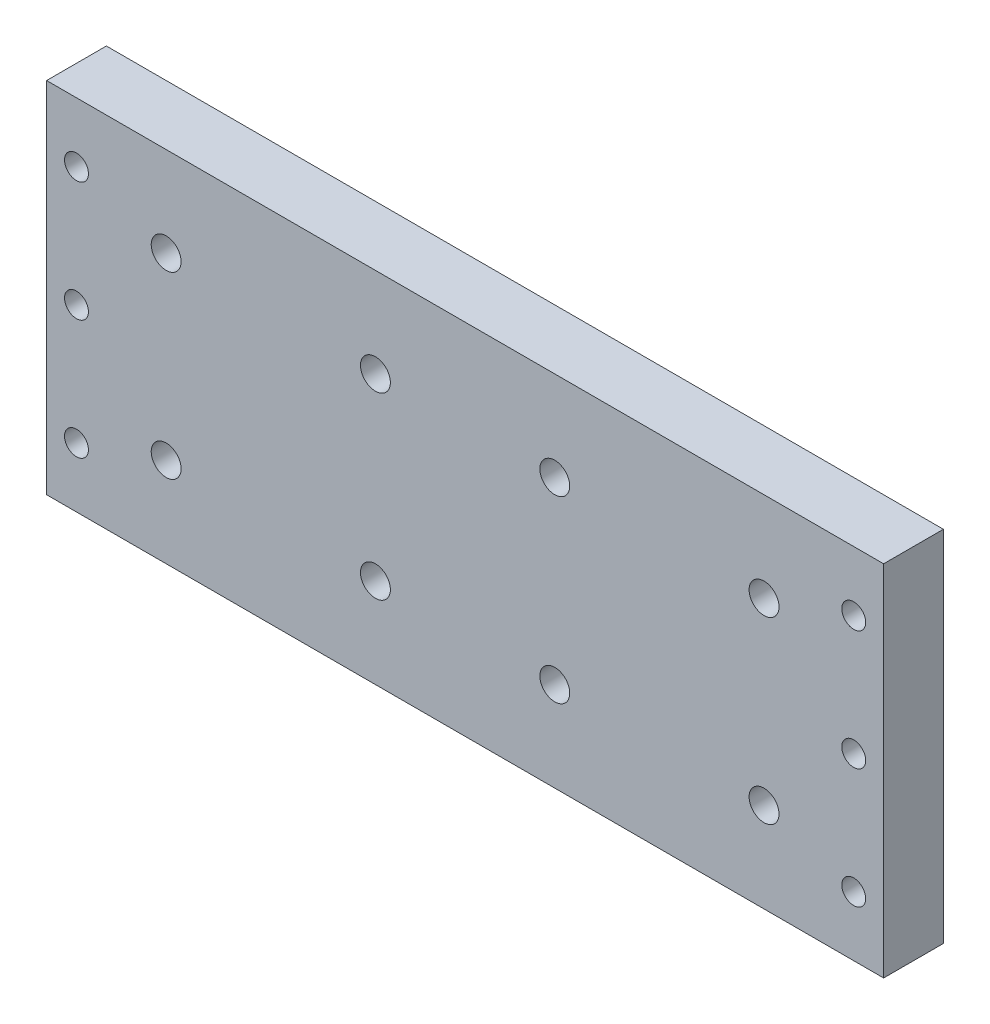
ISO-10303-21;
HEADER;
FILE_DESCRIPTION(('STEP AP214'),'2;1');
FILE_NAME('part.step','',(''),(''),'','','');
FILE_SCHEMA(('AUTOMOTIVE_DESIGN { 1 0 10303 214 1 1 1 1 }'));
ENDSEC;
DATA;
#1=APPLICATION_CONTEXT('core data for automotive mechanical design processes');
#2=APPLICATION_PROTOCOL_DEFINITION('international standard','automotive_design',2000,#1);
#3=PRODUCT_CONTEXT('',#1,'mechanical');
#4=PRODUCT('Part','Part','',(#3));
#5=PRODUCT_RELATED_PRODUCT_CATEGORY('part','',(#4));
#6=PRODUCT_DEFINITION_FORMATION('','',#4);
#7=PRODUCT_DEFINITION_CONTEXT('part definition',#1,'design');
#8=PRODUCT_DEFINITION('design','',#6,#7);
#9=PRODUCT_DEFINITION_SHAPE('','',#8);
#10=(LENGTH_UNIT() NAMED_UNIT(*) SI_UNIT(.MILLI.,.METRE.));
#11=(NAMED_UNIT(*) PLANE_ANGLE_UNIT() SI_UNIT($,.RADIAN.));
#12=(NAMED_UNIT(*) SI_UNIT($,.STERADIAN.) SOLID_ANGLE_UNIT());
#13=UNCERTAINTY_MEASURE_WITH_UNIT(LENGTH_MEASURE(1.E-05),#10,'distance_accuracy_value','');
#14=(GEOMETRIC_REPRESENTATION_CONTEXT(3) GLOBAL_UNCERTAINTY_ASSIGNED_CONTEXT((#13)) GLOBAL_UNIT_ASSIGNED_CONTEXT((#10,
#11,#12)) REPRESENTATION_CONTEXT('',''));
#15=CARTESIAN_POINT('',(0.,0.,0.));
#16=DIRECTION('',(0.,0.,1.));
#17=DIRECTION('',(1.,0.,0.));
#18=AXIS2_PLACEMENT_3D('',#15,#16,#17);
#19=CARTESIAN_POINT('',(0.,0.,10.));
#20=DIRECTION('',(0.,0.,-1.));
#21=DIRECTION('',(-1.,0.,0.));
#22=AXIS2_PLACEMENT_3D('',#19,#20,#21);
#23=PLANE('',#22);
#24=DIRECTION('',(0.,1.,0.));
#25=VECTOR('',#24,1.);
#26=CARTESIAN_POINT('',(70.,-30.,10.));
#27=LINE('',#26,#25);
#28=CARTESIAN_POINT('',(70.,-30.,10.));
#29=VERTEX_POINT('',#28);
#30=CARTESIAN_POINT('',(70.,30.,10.));
#31=VERTEX_POINT('',#30);
#32=EDGE_CURVE('E91',#29,#31,#27,.T.);
#33=ORIENTED_EDGE('',*,*,#32,.T.);
#34=DIRECTION('',(-1.,0.,0.));
#35=VECTOR('',#34,1.);
#36=CARTESIAN_POINT('',(-70.,30.,10.));
#37=LINE('',#36,#35);
#38=CARTESIAN_POINT('',(-70.,30.,10.));
#39=VERTEX_POINT('',#38);
#40=EDGE_CURVE('E86',#31,#39,#37,.T.);
#41=ORIENTED_EDGE('',*,*,#40,.T.);
#42=DIRECTION('',(0.,-1.,0.));
#43=VECTOR('',#42,1.);
#44=CARTESIAN_POINT('',(-70.,-30.,10.));
#45=LINE('',#44,#43);
#46=CARTESIAN_POINT('',(-70.,-30.,10.));
#47=VERTEX_POINT('',#46);
#48=EDGE_CURVE('E89',#39,#47,#45,.T.);
#49=ORIENTED_EDGE('',*,*,#48,.T.);
#50=DIRECTION('',(1.,0.,0.));
#51=VECTOR('',#50,1.);
#52=CARTESIAN_POINT('',(-70.,-30.,10.));
#53=LINE('',#52,#51);
#54=EDGE_CURVE('E56',#47,#29,#53,.T.);
#55=ORIENTED_EDGE('',*,*,#54,.T.);
#56=EDGE_LOOP('',(#33,#41,#49,#55));
#57=FACE_BOUND('',#56,.T.);
#58=CARTESIAN_POINT('',(-65.,0.,10.));
#59=DIRECTION('',(0.,0.,1.));
#60=DIRECTION('',(1.,0.,0.));
#61=AXIS2_PLACEMENT_3D('',#58,#59,#60);
#62=CIRCLE('',#61,2.);
#63=CARTESIAN_POINT('',(-63.,0.,10.));
#64=VERTEX_POINT('',#63);
#65=EDGE_CURVE('E106',#64,#64,#62,.T.);
#66=ORIENTED_EDGE('',*,*,#65,.F.);
#67=EDGE_LOOP('',(#66));
#68=FACE_BOUND('',#67,.T.);
#69=CARTESIAN_POINT('',(-65.,20.,10.));
#70=DIRECTION('',(0.,0.,1.));
#71=DIRECTION('',(1.,0.,0.));
#72=AXIS2_PLACEMENT_3D('',#69,#70,#71);
#73=CIRCLE('',#72,2.);
#74=CARTESIAN_POINT('',(-63.,20.,10.));
#75=VERTEX_POINT('',#74);
#76=EDGE_CURVE('E121',#75,#75,#73,.T.);
#77=ORIENTED_EDGE('',*,*,#76,.F.);
#78=EDGE_LOOP('',(#77));
#79=FACE_BOUND('',#78,.T.);
#80=CARTESIAN_POINT('',(-65.,-20.,10.));
#81=DIRECTION('',(0.,0.,1.));
#82=DIRECTION('',(1.,0.,0.));
#83=AXIS2_PLACEMENT_3D('',#80,#81,#82);
#84=CIRCLE('',#83,2.);
#85=CARTESIAN_POINT('',(-63.,-20.,10.));
#86=VERTEX_POINT('',#85);
#87=EDGE_CURVE('E127',#86,#86,#84,.T.);
#88=ORIENTED_EDGE('',*,*,#87,.F.);
#89=EDGE_LOOP('',(#88));
#90=FACE_BOUND('',#89,.T.);
#91=CARTESIAN_POINT('',(-50.,-15.,10.));
#92=DIRECTION('',(0.,0.,1.));
#93=DIRECTION('',(1.,0.,0.));
#94=AXIS2_PLACEMENT_3D('',#91,#92,#93);
#95=CIRCLE('',#94,2.5);
#96=CARTESIAN_POINT('',(-47.5,-15.,10.));
#97=VERTEX_POINT('',#96);
#98=EDGE_CURVE('E133',#97,#97,#95,.T.);
#99=ORIENTED_EDGE('',*,*,#98,.F.);
#100=EDGE_LOOP('',(#99));
#101=FACE_BOUND('',#100,.T.);
#102=CARTESIAN_POINT('',(65.,-20.,10.));
#103=DIRECTION('',(0.,0.,1.));
#104=DIRECTION('',(-1.,0.,0.));
#105=AXIS2_PLACEMENT_3D('',#102,#103,#104);
#106=CIRCLE('',#105,2.);
#107=CARTESIAN_POINT('',(63.,-20.,10.));
#108=VERTEX_POINT('',#107);
#109=EDGE_CURVE('E139',#108,#108,#106,.T.);
#110=ORIENTED_EDGE('',*,*,#109,.F.);
#111=EDGE_LOOP('',(#110));
#112=FACE_BOUND('',#111,.T.);
#113=CARTESIAN_POINT('',(65.,20.,10.));
#114=DIRECTION('',(0.,0.,1.));
#115=DIRECTION('',(-1.,0.,0.));
#116=AXIS2_PLACEMENT_3D('',#113,#114,#115);
#117=CIRCLE('',#116,2.);
#118=CARTESIAN_POINT('',(63.,20.,10.));
#119=VERTEX_POINT('',#118);
#120=EDGE_CURVE('E145',#119,#119,#117,.T.);
#121=ORIENTED_EDGE('',*,*,#120,.F.);
#122=EDGE_LOOP('',(#121));
#123=FACE_BOUND('',#122,.T.);
#124=CARTESIAN_POINT('',(65.,0.,10.));
#125=DIRECTION('',(0.,0.,1.));
#126=DIRECTION('',(-1.,0.,0.));
#127=AXIS2_PLACEMENT_3D('',#124,#125,#126);
#128=CIRCLE('',#127,2.);
#129=CARTESIAN_POINT('',(63.,0.,10.));
#130=VERTEX_POINT('',#129);
#131=EDGE_CURVE('E151',#130,#130,#128,.T.);
#132=ORIENTED_EDGE('',*,*,#131,.F.);
#133=EDGE_LOOP('',(#132));
#134=FACE_BOUND('',#133,.T.);
#135=CARTESIAN_POINT('',(-50.,15.,10.));
#136=DIRECTION('',(0.,0.,1.));
#137=DIRECTION('',(1.,0.,0.));
#138=AXIS2_PLACEMENT_3D('',#135,#136,#137);
#139=CIRCLE('',#138,2.5);
#140=CARTESIAN_POINT('',(-47.5,15.,10.));
#141=VERTEX_POINT('',#140);
#142=EDGE_CURVE('E157',#141,#141,#139,.T.);
#143=ORIENTED_EDGE('',*,*,#142,.F.);
#144=EDGE_LOOP('',(#143));
#145=FACE_BOUND('',#144,.T.);
#146=CARTESIAN_POINT('',(-15.,15.,10.));
#147=DIRECTION('',(0.,0.,1.));
#148=DIRECTION('',(1.,0.,0.));
#149=AXIS2_PLACEMENT_3D('',#146,#147,#148);
#150=CIRCLE('',#149,2.5);
#151=CARTESIAN_POINT('',(-12.5,15.,10.));
#152=VERTEX_POINT('',#151);
#153=EDGE_CURVE('E163',#152,#152,#150,.T.);
#154=ORIENTED_EDGE('',*,*,#153,.F.);
#155=EDGE_LOOP('',(#154));
#156=FACE_BOUND('',#155,.T.);
#157=CARTESIAN_POINT('',(-15.,-15.,10.));
#158=DIRECTION('',(0.,0.,1.));
#159=DIRECTION('',(1.,0.,0.));
#160=AXIS2_PLACEMENT_3D('',#157,#158,#159);
#161=CIRCLE('',#160,2.5);
#162=CARTESIAN_POINT('',(-12.5,-15.,10.));
#163=VERTEX_POINT('',#162);
#164=EDGE_CURVE('E169',#163,#163,#161,.T.);
#165=ORIENTED_EDGE('',*,*,#164,.F.);
#166=EDGE_LOOP('',(#165));
#167=FACE_BOUND('',#166,.T.);
#168=CARTESIAN_POINT('',(15.,-15.,10.));
#169=DIRECTION('',(0.,0.,1.));
#170=DIRECTION('',(-1.,0.,0.));
#171=AXIS2_PLACEMENT_3D('',#168,#169,#170);
#172=CIRCLE('',#171,2.5);
#173=CARTESIAN_POINT('',(12.5,-15.,10.));
#174=VERTEX_POINT('',#173);
#175=EDGE_CURVE('E175',#174,#174,#172,.T.);
#176=ORIENTED_EDGE('',*,*,#175,.F.);
#177=EDGE_LOOP('',(#176));
#178=FACE_BOUND('',#177,.T.);
#179=CARTESIAN_POINT('',(15.,15.,10.));
#180=DIRECTION('',(0.,0.,1.));
#181=DIRECTION('',(-1.,0.,0.));
#182=AXIS2_PLACEMENT_3D('',#179,#180,#181);
#183=CIRCLE('',#182,2.5);
#184=CARTESIAN_POINT('',(12.5,15.,10.));
#185=VERTEX_POINT('',#184);
#186=EDGE_CURVE('E181',#185,#185,#183,.T.);
#187=ORIENTED_EDGE('',*,*,#186,.F.);
#188=EDGE_LOOP('',(#187));
#189=FACE_BOUND('',#188,.T.);
#190=CARTESIAN_POINT('',(50.,-15.,10.));
#191=DIRECTION('',(0.,0.,1.));
#192=DIRECTION('',(-1.,0.,0.));
#193=AXIS2_PLACEMENT_3D('',#190,#191,#192);
#194=CIRCLE('',#193,2.5);
#195=CARTESIAN_POINT('',(47.5,-15.,10.));
#196=VERTEX_POINT('',#195);
#197=EDGE_CURVE('E187',#196,#196,#194,.T.);
#198=ORIENTED_EDGE('',*,*,#197,.F.);
#199=EDGE_LOOP('',(#198));
#200=FACE_BOUND('',#199,.T.);
#201=CARTESIAN_POINT('',(50.,15.,10.));
#202=DIRECTION('',(0.,0.,1.));
#203=DIRECTION('',(-1.,0.,0.));
#204=AXIS2_PLACEMENT_3D('',#201,#202,#203);
#205=CIRCLE('',#204,2.5);
#206=CARTESIAN_POINT('',(47.5,15.,10.));
#207=VERTEX_POINT('',#206);
#208=EDGE_CURVE('E193',#207,#207,#205,.T.);
#209=ORIENTED_EDGE('',*,*,#208,.F.);
#210=EDGE_LOOP('',(#209));
#211=FACE_BOUND('',#210,.T.);
#212=ADVANCED_FACE('F39',(#57,#68,#79,#90,#101,#112,#123,#134,#145,#156,#167,#178,#189,#200,
#211),#23,.F.);
#213=CARTESIAN_POINT('',(0.,0.,0.));
#214=DIRECTION('',(0.,0.,-1.));
#215=DIRECTION('',(-1.,0.,0.));
#216=AXIS2_PLACEMENT_3D('',#213,#214,#215);
#217=PLANE('',#216);
#218=CARTESIAN_POINT('',(50.,-15.,0.));
#219=DIRECTION('',(0.,0.,1.));
#220=DIRECTION('',(-1.,0.,0.));
#221=AXIS2_PLACEMENT_3D('',#218,#219,#220);
#222=CIRCLE('',#221,2.5);
#223=CARTESIAN_POINT('',(47.5,-15.,0.));
#224=VERTEX_POINT('',#223);
#225=EDGE_CURVE('E190',#224,#224,#222,.T.);
#226=ORIENTED_EDGE('',*,*,#225,.T.);
#227=EDGE_LOOP('',(#226));
#228=FACE_BOUND('',#227,.T.);
#229=CARTESIAN_POINT('',(15.,-15.,0.));
#230=DIRECTION('',(0.,0.,1.));
#231=DIRECTION('',(-1.,0.,0.));
#232=AXIS2_PLACEMENT_3D('',#229,#230,#231);
#233=CIRCLE('',#232,2.5);
#234=CARTESIAN_POINT('',(12.5,-15.,0.));
#235=VERTEX_POINT('',#234);
#236=EDGE_CURVE('E178',#235,#235,#233,.T.);
#237=ORIENTED_EDGE('',*,*,#236,.T.);
#238=EDGE_LOOP('',(#237));
#239=FACE_BOUND('',#238,.T.);
#240=CARTESIAN_POINT('',(-15.,15.,0.));
#241=DIRECTION('',(0.,0.,1.));
#242=DIRECTION('',(1.,0.,0.));
#243=AXIS2_PLACEMENT_3D('',#240,#241,#242);
#244=CIRCLE('',#243,2.5);
#245=CARTESIAN_POINT('',(-12.5,15.,0.));
#246=VERTEX_POINT('',#245);
#247=EDGE_CURVE('E166',#246,#246,#244,.T.);
#248=ORIENTED_EDGE('',*,*,#247,.T.);
#249=EDGE_LOOP('',(#248));
#250=FACE_BOUND('',#249,.T.);
#251=CARTESIAN_POINT('',(65.,0.,0.));
#252=DIRECTION('',(0.,0.,1.));
#253=DIRECTION('',(-1.,0.,0.));
#254=AXIS2_PLACEMENT_3D('',#251,#252,#253);
#255=CIRCLE('',#254,2.);
#256=CARTESIAN_POINT('',(63.,0.,0.));
#257=VERTEX_POINT('',#256);
#258=EDGE_CURVE('E154',#257,#257,#255,.T.);
#259=ORIENTED_EDGE('',*,*,#258,.T.);
#260=EDGE_LOOP('',(#259));
#261=FACE_BOUND('',#260,.T.);
#262=CARTESIAN_POINT('',(65.,-20.,0.));
#263=DIRECTION('',(0.,0.,1.));
#264=DIRECTION('',(-1.,0.,0.));
#265=AXIS2_PLACEMENT_3D('',#262,#263,#264);
#266=CIRCLE('',#265,2.);
#267=CARTESIAN_POINT('',(63.,-20.,0.));
#268=VERTEX_POINT('',#267);
#269=EDGE_CURVE('E142',#268,#268,#266,.T.);
#270=ORIENTED_EDGE('',*,*,#269,.T.);
#271=EDGE_LOOP('',(#270));
#272=FACE_BOUND('',#271,.T.);
#273=CARTESIAN_POINT('',(-65.,-20.,0.));
#274=DIRECTION('',(0.,0.,1.));
#275=DIRECTION('',(1.,0.,0.));
#276=AXIS2_PLACEMENT_3D('',#273,#274,#275);
#277=CIRCLE('',#276,2.);
#278=CARTESIAN_POINT('',(-63.,-20.,0.));
#279=VERTEX_POINT('',#278);
#280=EDGE_CURVE('E130',#279,#279,#277,.T.);
#281=ORIENTED_EDGE('',*,*,#280,.T.);
#282=EDGE_LOOP('',(#281));
#283=FACE_BOUND('',#282,.T.);
#284=CARTESIAN_POINT('',(-65.,0.,0.));
#285=DIRECTION('',(0.,0.,1.));
#286=DIRECTION('',(1.,0.,0.));
#287=AXIS2_PLACEMENT_3D('',#284,#285,#286);
#288=CIRCLE('',#287,2.);
#289=CARTESIAN_POINT('',(-63.,0.,0.));
#290=VERTEX_POINT('',#289);
#291=EDGE_CURVE('E118',#290,#290,#288,.T.);
#292=ORIENTED_EDGE('',*,*,#291,.T.);
#293=EDGE_LOOP('',(#292));
#294=FACE_BOUND('',#293,.T.);
#295=DIRECTION('',(0.,1.,0.));
#296=VECTOR('',#295,1.);
#297=CARTESIAN_POINT('',(70.,-30.,0.));
#298=LINE('',#297,#296);
#299=CARTESIAN_POINT('',(70.,-30.,0.));
#300=VERTEX_POINT('',#299);
#301=CARTESIAN_POINT('',(70.,30.,0.));
#302=VERTEX_POINT('',#301);
#303=EDGE_CURVE('E103',#300,#302,#298,.T.);
#304=ORIENTED_EDGE('',*,*,#303,.F.);
#305=DIRECTION('',(1.,0.,0.));
#306=VECTOR('',#305,1.);
#307=CARTESIAN_POINT('',(-70.,-30.,0.));
#308=LINE('',#307,#306);
#309=CARTESIAN_POINT('',(-70.,-30.,0.));
#310=VERTEX_POINT('',#309);
#311=EDGE_CURVE('E79',#310,#300,#308,.T.);
#312=ORIENTED_EDGE('',*,*,#311,.F.);
#313=DIRECTION('',(0.,-1.,0.));
#314=VECTOR('',#313,1.);
#315=CARTESIAN_POINT('',(-70.,-30.,0.));
#316=LINE('',#315,#314);
#317=CARTESIAN_POINT('',(-70.,30.,0.));
#318=VERTEX_POINT('',#317);
#319=EDGE_CURVE('E73',#318,#310,#316,.T.);
#320=ORIENTED_EDGE('',*,*,#319,.F.);
#321=DIRECTION('',(-1.,0.,0.));
#322=VECTOR('',#321,1.);
#323=CARTESIAN_POINT('',(-70.,30.,0.));
#324=LINE('',#323,#322);
#325=EDGE_CURVE('E95',#302,#318,#324,.T.);
#326=ORIENTED_EDGE('',*,*,#325,.F.);
#327=EDGE_LOOP('',(#304,#312,#320,#326));
#328=FACE_BOUND('',#327,.T.);
#329=CARTESIAN_POINT('',(-65.,20.,0.));
#330=DIRECTION('',(0.,0.,1.));
#331=DIRECTION('',(1.,0.,0.));
#332=AXIS2_PLACEMENT_3D('',#329,#330,#331);
#333=CIRCLE('',#332,2.);
#334=CARTESIAN_POINT('',(-63.,20.,0.));
#335=VERTEX_POINT('',#334);
#336=EDGE_CURVE('E124',#335,#335,#333,.T.);
#337=ORIENTED_EDGE('',*,*,#336,.T.);
#338=EDGE_LOOP('',(#337));
#339=FACE_BOUND('',#338,.T.);
#340=CARTESIAN_POINT('',(-50.,-15.,0.));
#341=DIRECTION('',(0.,0.,1.));
#342=DIRECTION('',(1.,0.,0.));
#343=AXIS2_PLACEMENT_3D('',#340,#341,#342);
#344=CIRCLE('',#343,2.5);
#345=CARTESIAN_POINT('',(-47.5,-15.,0.));
#346=VERTEX_POINT('',#345);
#347=EDGE_CURVE('E136',#346,#346,#344,.T.);
#348=ORIENTED_EDGE('',*,*,#347,.T.);
#349=EDGE_LOOP('',(#348));
#350=FACE_BOUND('',#349,.T.);
#351=CARTESIAN_POINT('',(65.,20.,0.));
#352=DIRECTION('',(0.,0.,1.));
#353=DIRECTION('',(-1.,0.,0.));
#354=AXIS2_PLACEMENT_3D('',#351,#352,#353);
#355=CIRCLE('',#354,2.);
#356=CARTESIAN_POINT('',(63.,20.,0.));
#357=VERTEX_POINT('',#356);
#358=EDGE_CURVE('E148',#357,#357,#355,.T.);
#359=ORIENTED_EDGE('',*,*,#358,.T.);
#360=EDGE_LOOP('',(#359));
#361=FACE_BOUND('',#360,.T.);
#362=CARTESIAN_POINT('',(-50.,15.,0.));
#363=DIRECTION('',(0.,0.,1.));
#364=DIRECTION('',(1.,0.,0.));
#365=AXIS2_PLACEMENT_3D('',#362,#363,#364);
#366=CIRCLE('',#365,2.5);
#367=CARTESIAN_POINT('',(-47.5,15.,0.));
#368=VERTEX_POINT('',#367);
#369=EDGE_CURVE('E160',#368,#368,#366,.T.);
#370=ORIENTED_EDGE('',*,*,#369,.T.);
#371=EDGE_LOOP('',(#370));
#372=FACE_BOUND('',#371,.T.);
#373=CARTESIAN_POINT('',(-15.,-15.,0.));
#374=DIRECTION('',(0.,0.,1.));
#375=DIRECTION('',(1.,0.,0.));
#376=AXIS2_PLACEMENT_3D('',#373,#374,#375);
#377=CIRCLE('',#376,2.5);
#378=CARTESIAN_POINT('',(-12.5,-15.,0.));
#379=VERTEX_POINT('',#378);
#380=EDGE_CURVE('E172',#379,#379,#377,.T.);
#381=ORIENTED_EDGE('',*,*,#380,.T.);
#382=EDGE_LOOP('',(#381));
#383=FACE_BOUND('',#382,.T.);
#384=CARTESIAN_POINT('',(15.,15.,0.));
#385=DIRECTION('',(0.,0.,1.));
#386=DIRECTION('',(-1.,0.,0.));
#387=AXIS2_PLACEMENT_3D('',#384,#385,#386);
#388=CIRCLE('',#387,2.5);
#389=CARTESIAN_POINT('',(12.5,15.,0.));
#390=VERTEX_POINT('',#389);
#391=EDGE_CURVE('E184',#390,#390,#388,.T.);
#392=ORIENTED_EDGE('',*,*,#391,.T.);
#393=EDGE_LOOP('',(#392));
#394=FACE_BOUND('',#393,.T.);
#395=CARTESIAN_POINT('',(50.,15.,0.));
#396=DIRECTION('',(0.,0.,1.));
#397=DIRECTION('',(-1.,0.,0.));
#398=AXIS2_PLACEMENT_3D('',#395,#396,#397);
#399=CIRCLE('',#398,2.5);
#400=CARTESIAN_POINT('',(47.5,15.,0.));
#401=VERTEX_POINT('',#400);
#402=EDGE_CURVE('E196',#401,#401,#399,.T.);
#403=ORIENTED_EDGE('',*,*,#402,.T.);
#404=EDGE_LOOP('',(#403));
#405=FACE_BOUND('',#404,.T.);
#406=ADVANCED_FACE('F114',(#228,#239,#250,#261,#272,#283,#294,#328,#339,#350,#361,#372,#383,
#394,#405),#217,.T.);
#407=CARTESIAN_POINT('',(70.,-30.,10.));
#408=DIRECTION('',(-1.,0.,0.));
#409=DIRECTION('',(0.,0.,1.));
#410=AXIS2_PLACEMENT_3D('',#407,#408,#409);
#411=PLANE('',#410);
#412=ORIENTED_EDGE('',*,*,#303,.T.);
#413=DIRECTION('',(0.,0.,-1.));
#414=VECTOR('',#413,1.);
#415=CARTESIAN_POINT('',(70.,30.,10.));
#416=LINE('',#415,#414);
#417=EDGE_CURVE('E11',#31,#302,#416,.T.);
#418=ORIENTED_EDGE('',*,*,#417,.F.);
#419=ORIENTED_EDGE('',*,*,#32,.F.);
#420=DIRECTION('',(0.,0.,-1.));
#421=VECTOR('',#420,1.);
#422=CARTESIAN_POINT('',(70.,-30.,10.));
#423=LINE('',#422,#421);
#424=EDGE_CURVE('E99',#29,#300,#423,.T.);
#425=ORIENTED_EDGE('',*,*,#424,.T.);
#426=EDGE_LOOP('',(#412,#418,#419,#425));
#427=FACE_BOUND('',#426,.T.);
#428=ADVANCED_FACE('F41',(#427),#411,.F.);
#429=CARTESIAN_POINT('',(-70.,30.,10.));
#430=DIRECTION('',(0.,-1.,0.));
#431=DIRECTION('',(0.,0.,-1.));
#432=AXIS2_PLACEMENT_3D('',#429,#430,#431);
#433=PLANE('',#432);
#434=ORIENTED_EDGE('',*,*,#325,.T.);
#435=DIRECTION('',(0.,0.,-1.));
#436=VECTOR('',#435,1.);
#437=CARTESIAN_POINT('',(-70.,30.,10.));
#438=LINE('',#437,#436);
#439=EDGE_CURVE('E48',#39,#318,#438,.T.);
#440=ORIENTED_EDGE('',*,*,#439,.F.);
#441=ORIENTED_EDGE('',*,*,#40,.F.);
#442=ORIENTED_EDGE('',*,*,#417,.T.);
#443=EDGE_LOOP('',(#434,#440,#441,#442));
#444=FACE_BOUND('',#443,.T.);
#445=ADVANCED_FACE('F94',(#444),#433,.F.);
#446=CARTESIAN_POINT('',(-70.,-30.,10.));
#447=DIRECTION('',(1.,0.,0.));
#448=DIRECTION('',(0.,0.,-1.));
#449=AXIS2_PLACEMENT_3D('',#446,#447,#448);
#450=PLANE('',#449);
#451=ORIENTED_EDGE('',*,*,#319,.T.);
#452=DIRECTION('',(0.,0.,-1.));
#453=VECTOR('',#452,1.);
#454=CARTESIAN_POINT('',(-70.,-30.,10.));
#455=LINE('',#454,#453);
#456=EDGE_CURVE('E96',#47,#310,#455,.T.);
#457=ORIENTED_EDGE('',*,*,#456,.F.);
#458=ORIENTED_EDGE('',*,*,#48,.F.);
#459=ORIENTED_EDGE('',*,*,#439,.T.);
#460=EDGE_LOOP('',(#451,#457,#458,#459));
#461=FACE_BOUND('',#460,.T.);
#462=ADVANCED_FACE('F97',(#461),#450,.F.);
#463=CARTESIAN_POINT('',(-70.,-30.,10.));
#464=DIRECTION('',(0.,1.,0.));
#465=DIRECTION('',(0.,0.,1.));
#466=AXIS2_PLACEMENT_3D('',#463,#464,#465);
#467=PLANE('',#466);
#468=ORIENTED_EDGE('',*,*,#311,.T.);
#469=ORIENTED_EDGE('',*,*,#424,.F.);
#470=ORIENTED_EDGE('',*,*,#54,.F.);
#471=ORIENTED_EDGE('',*,*,#456,.T.);
#472=EDGE_LOOP('',(#468,#469,#470,#471));
#473=FACE_BOUND('',#472,.T.);
#474=ADVANCED_FACE('F111',(#473),#467,.F.);
#475=CARTESIAN_POINT('',(-65.,0.,10.));
#476=DIRECTION('',(0.,0.,-1.));
#477=DIRECTION('',(-1.,0.,0.));
#478=AXIS2_PLACEMENT_3D('',#475,#476,#477);
#479=CYLINDRICAL_SURFACE('',#478,2.);
#480=ORIENTED_EDGE('',*,*,#65,.T.);
#481=EDGE_LOOP('',(#480));
#482=FACE_BOUND('',#481,.T.);
#483=ORIENTED_EDGE('',*,*,#291,.F.);
#484=EDGE_LOOP('',(#483));
#485=FACE_BOUND('',#484,.T.);
#486=ADVANCED_FACE('F213',(#482,#485),#479,.F.);
#487=CARTESIAN_POINT('',(-65.,20.,10.));
#488=DIRECTION('',(0.,0.,-1.));
#489=DIRECTION('',(-1.,0.,0.));
#490=AXIS2_PLACEMENT_3D('',#487,#488,#489);
#491=CYLINDRICAL_SURFACE('',#490,2.);
#492=ORIENTED_EDGE('',*,*,#76,.T.);
#493=EDGE_LOOP('',(#492));
#494=FACE_BOUND('',#493,.T.);
#495=ORIENTED_EDGE('',*,*,#336,.F.);
#496=EDGE_LOOP('',(#495));
#497=FACE_BOUND('',#496,.T.);
#498=ADVANCED_FACE('F259',(#494,#497),#491,.F.);
#499=CARTESIAN_POINT('',(-65.,-20.,10.));
#500=DIRECTION('',(0.,0.,-1.));
#501=DIRECTION('',(-1.,0.,0.));
#502=AXIS2_PLACEMENT_3D('',#499,#500,#501);
#503=CYLINDRICAL_SURFACE('',#502,2.);
#504=ORIENTED_EDGE('',*,*,#87,.T.);
#505=EDGE_LOOP('',(#504));
#506=FACE_BOUND('',#505,.T.);
#507=ORIENTED_EDGE('',*,*,#280,.F.);
#508=EDGE_LOOP('',(#507));
#509=FACE_BOUND('',#508,.T.);
#510=ADVANCED_FACE('F267',(#506,#509),#503,.F.);
#511=CARTESIAN_POINT('',(-50.,-15.,10.));
#512=DIRECTION('',(0.,0.,-1.));
#513=DIRECTION('',(-1.,0.,0.));
#514=AXIS2_PLACEMENT_3D('',#511,#512,#513);
#515=CYLINDRICAL_SURFACE('',#514,2.5);
#516=ORIENTED_EDGE('',*,*,#98,.T.);
#517=EDGE_LOOP('',(#516));
#518=FACE_BOUND('',#517,.T.);
#519=ORIENTED_EDGE('',*,*,#347,.F.);
#520=EDGE_LOOP('',(#519));
#521=FACE_BOUND('',#520,.T.);
#522=ADVANCED_FACE('F275',(#518,#521),#515,.F.);
#523=CARTESIAN_POINT('',(65.,-20.,10.));
#524=DIRECTION('',(0.,0.,-1.));
#525=DIRECTION('',(-1.,0.,0.));
#526=AXIS2_PLACEMENT_3D('',#523,#524,#525);
#527=CYLINDRICAL_SURFACE('',#526,2.);
#528=ORIENTED_EDGE('',*,*,#109,.T.);
#529=EDGE_LOOP('',(#528));
#530=FACE_BOUND('',#529,.T.);
#531=ORIENTED_EDGE('',*,*,#269,.F.);
#532=EDGE_LOOP('',(#531));
#533=FACE_BOUND('',#532,.T.);
#534=ADVANCED_FACE('F284',(#530,#533),#527,.F.);
#535=CARTESIAN_POINT('',(65.,20.,10.));
#536=DIRECTION('',(0.,0.,-1.));
#537=DIRECTION('',(-1.,0.,0.));
#538=AXIS2_PLACEMENT_3D('',#535,#536,#537);
#539=CYLINDRICAL_SURFACE('',#538,2.);
#540=ORIENTED_EDGE('',*,*,#120,.T.);
#541=EDGE_LOOP('',(#540));
#542=FACE_BOUND('',#541,.T.);
#543=ORIENTED_EDGE('',*,*,#358,.F.);
#544=EDGE_LOOP('',(#543));
#545=FACE_BOUND('',#544,.T.);
#546=ADVANCED_FACE('F293',(#542,#545),#539,.F.);
#547=CARTESIAN_POINT('',(65.,0.,10.));
#548=DIRECTION('',(0.,0.,-1.));
#549=DIRECTION('',(-1.,0.,0.));
#550=AXIS2_PLACEMENT_3D('',#547,#548,#549);
#551=CYLINDRICAL_SURFACE('',#550,2.);
#552=ORIENTED_EDGE('',*,*,#131,.T.);
#553=EDGE_LOOP('',(#552));
#554=FACE_BOUND('',#553,.T.);
#555=ORIENTED_EDGE('',*,*,#258,.F.);
#556=EDGE_LOOP('',(#555));
#557=FACE_BOUND('',#556,.T.);
#558=ADVANCED_FACE('F302',(#554,#557),#551,.F.);
#559=CARTESIAN_POINT('',(-50.,15.,10.));
#560=DIRECTION('',(0.,0.,-1.));
#561=DIRECTION('',(-1.,0.,0.));
#562=AXIS2_PLACEMENT_3D('',#559,#560,#561);
#563=CYLINDRICAL_SURFACE('',#562,2.5);
#564=ORIENTED_EDGE('',*,*,#142,.T.);
#565=EDGE_LOOP('',(#564));
#566=FACE_BOUND('',#565,.T.);
#567=ORIENTED_EDGE('',*,*,#369,.F.);
#568=EDGE_LOOP('',(#567));
#569=FACE_BOUND('',#568,.T.);
#570=ADVANCED_FACE('F311',(#566,#569),#563,.F.);
#571=CARTESIAN_POINT('',(-15.,15.,10.));
#572=DIRECTION('',(0.,0.,-1.));
#573=DIRECTION('',(-1.,0.,0.));
#574=AXIS2_PLACEMENT_3D('',#571,#572,#573);
#575=CYLINDRICAL_SURFACE('',#574,2.5);
#576=ORIENTED_EDGE('',*,*,#153,.T.);
#577=EDGE_LOOP('',(#576));
#578=FACE_BOUND('',#577,.T.);
#579=ORIENTED_EDGE('',*,*,#247,.F.);
#580=EDGE_LOOP('',(#579));
#581=FACE_BOUND('',#580,.T.);
#582=ADVANCED_FACE('F320',(#578,#581),#575,.F.);
#583=CARTESIAN_POINT('',(-15.,-15.,10.));
#584=DIRECTION('',(0.,0.,-1.));
#585=DIRECTION('',(-1.,0.,0.));
#586=AXIS2_PLACEMENT_3D('',#583,#584,#585);
#587=CYLINDRICAL_SURFACE('',#586,2.5);
#588=ORIENTED_EDGE('',*,*,#164,.T.);
#589=EDGE_LOOP('',(#588));
#590=FACE_BOUND('',#589,.T.);
#591=ORIENTED_EDGE('',*,*,#380,.F.);
#592=EDGE_LOOP('',(#591));
#593=FACE_BOUND('',#592,.T.);
#594=ADVANCED_FACE('F329',(#590,#593),#587,.F.);
#595=CARTESIAN_POINT('',(15.,-15.,10.));
#596=DIRECTION('',(0.,0.,-1.));
#597=DIRECTION('',(-1.,0.,0.));
#598=AXIS2_PLACEMENT_3D('',#595,#596,#597);
#599=CYLINDRICAL_SURFACE('',#598,2.5);
#600=ORIENTED_EDGE('',*,*,#175,.T.);
#601=EDGE_LOOP('',(#600));
#602=FACE_BOUND('',#601,.T.);
#603=ORIENTED_EDGE('',*,*,#236,.F.);
#604=EDGE_LOOP('',(#603));
#605=FACE_BOUND('',#604,.T.);
#606=ADVANCED_FACE('F338',(#602,#605),#599,.F.);
#607=CARTESIAN_POINT('',(15.,15.,10.));
#608=DIRECTION('',(0.,0.,-1.));
#609=DIRECTION('',(-1.,0.,0.));
#610=AXIS2_PLACEMENT_3D('',#607,#608,#609);
#611=CYLINDRICAL_SURFACE('',#610,2.5);
#612=ORIENTED_EDGE('',*,*,#186,.T.);
#613=EDGE_LOOP('',(#612));
#614=FACE_BOUND('',#613,.T.);
#615=ORIENTED_EDGE('',*,*,#391,.F.);
#616=EDGE_LOOP('',(#615));
#617=FACE_BOUND('',#616,.T.);
#618=ADVANCED_FACE('F347',(#614,#617),#611,.F.);
#619=CARTESIAN_POINT('',(50.,-15.,10.));
#620=DIRECTION('',(0.,0.,-1.));
#621=DIRECTION('',(-1.,0.,0.));
#622=AXIS2_PLACEMENT_3D('',#619,#620,#621);
#623=CYLINDRICAL_SURFACE('',#622,2.5);
#624=ORIENTED_EDGE('',*,*,#197,.T.);
#625=EDGE_LOOP('',(#624));
#626=FACE_BOUND('',#625,.T.);
#627=ORIENTED_EDGE('',*,*,#225,.F.);
#628=EDGE_LOOP('',(#627));
#629=FACE_BOUND('',#628,.T.);
#630=ADVANCED_FACE('F356',(#626,#629),#623,.F.);
#631=CARTESIAN_POINT('',(50.,15.,10.));
#632=DIRECTION('',(0.,0.,-1.));
#633=DIRECTION('',(-1.,0.,0.));
#634=AXIS2_PLACEMENT_3D('',#631,#632,#633);
#635=CYLINDRICAL_SURFACE('',#634,2.5);
#636=ORIENTED_EDGE('',*,*,#208,.T.);
#637=EDGE_LOOP('',(#636));
#638=FACE_BOUND('',#637,.T.);
#639=ORIENTED_EDGE('',*,*,#402,.F.);
#640=EDGE_LOOP('',(#639));
#641=FACE_BOUND('',#640,.T.);
#642=ADVANCED_FACE('F202',(#638,#641),#635,.F.);
#643=CLOSED_SHELL('',(#212,#406,#428,#445,#462,#474,#486,#498,#510,#522,#534,#546,#558,#570,
#582,#594,#606,#618,#630,#642));
#644=MANIFOLD_SOLID_BREP('B2',#643);
#645=ADVANCED_BREP_SHAPE_REPRESENTATION('',(#18,#644),#14);
#646=SHAPE_DEFINITION_REPRESENTATION(#9,#645);
ENDSEC;
END-ISO-10303-21;
